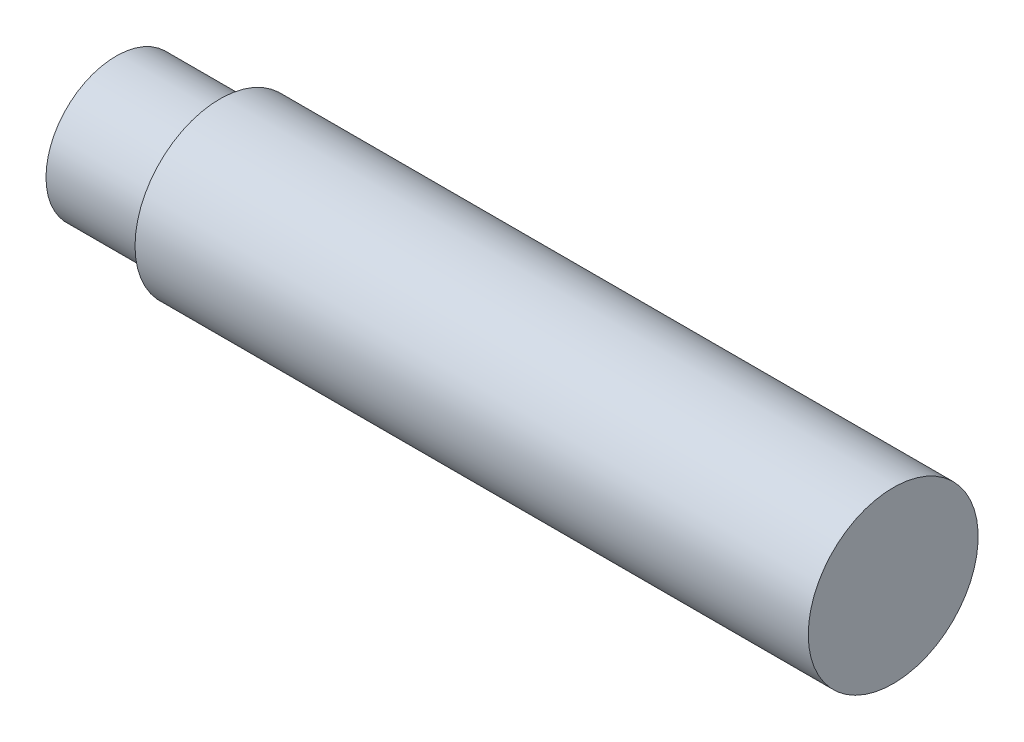
ISO-10303-21;
HEADER;
FILE_DESCRIPTION(('STEP AP214'),'2;1');
FILE_NAME('part.step','',(''),(''),'','','');
FILE_SCHEMA(('AUTOMOTIVE_DESIGN { 1 0 10303 214 1 1 1 1 }'));
ENDSEC;
DATA;
#1=APPLICATION_CONTEXT('core data for automotive mechanical design processes');
#2=APPLICATION_PROTOCOL_DEFINITION('international standard','automotive_design',2000,#1);
#3=PRODUCT_CONTEXT('',#1,'mechanical');
#4=PRODUCT('Part','Part','',(#3));
#5=PRODUCT_RELATED_PRODUCT_CATEGORY('part','',(#4));
#6=PRODUCT_DEFINITION_FORMATION('','',#4);
#7=PRODUCT_DEFINITION_CONTEXT('part definition',#1,'design');
#8=PRODUCT_DEFINITION('design','',#6,#7);
#9=PRODUCT_DEFINITION_SHAPE('','',#8);
#10=(LENGTH_UNIT() NAMED_UNIT(*) SI_UNIT(.MILLI.,.METRE.));
#11=(NAMED_UNIT(*) PLANE_ANGLE_UNIT() SI_UNIT($,.RADIAN.));
#12=(NAMED_UNIT(*) SI_UNIT($,.STERADIAN.) SOLID_ANGLE_UNIT());
#13=UNCERTAINTY_MEASURE_WITH_UNIT(LENGTH_MEASURE(1.E-05),#10,'distance_accuracy_value','');
#14=(GEOMETRIC_REPRESENTATION_CONTEXT(3) GLOBAL_UNCERTAINTY_ASSIGNED_CONTEXT((#13)) GLOBAL_UNIT_ASSIGNED_CONTEXT((#10,
#11,#12)) REPRESENTATION_CONTEXT('',''));
#15=CARTESIAN_POINT('',(0.,0.,0.));
#16=DIRECTION('',(0.,0.,1.));
#17=DIRECTION('',(1.,0.,0.));
#18=AXIS2_PLACEMENT_3D('',#15,#16,#17);
#19=CARTESIAN_POINT('',(0.,0.,0.));
#20=DIRECTION('',(-1.,0.,0.));
#21=DIRECTION('',(0.,0.,1.));
#22=AXIS2_PLACEMENT_3D('',#19,#20,#21);
#23=PLANE('',#22);
#24=CARTESIAN_POINT('',(0.,0.,0.));
#25=DIRECTION('',(-1.,0.,0.));
#26=DIRECTION('',(0.,0.,1.));
#27=AXIS2_PLACEMENT_3D('',#24,#25,#26);
#28=CIRCLE('',#27,1.5875);
#29=CARTESIAN_POINT('',(0.,0.,1.5875));
#30=VERTEX_POINT('',#29);
#31=EDGE_CURVE('E64',#30,#30,#28,.T.);
#32=ORIENTED_EDGE('',*,*,#31,.F.);
#33=EDGE_LOOP('',(#32));
#34=FACE_BOUND('',#33,.T.);
#35=CARTESIAN_POINT('',(0.,0.,0.));
#36=DIRECTION('',(-1.,0.,0.));
#37=DIRECTION('',(0.,0.,1.));
#38=AXIS2_PLACEMENT_3D('',#35,#36,#37);
#39=CIRCLE('',#38,1.9685);
#40=CARTESIAN_POINT('',(0.,0.,1.9685));
#41=VERTEX_POINT('',#40);
#42=EDGE_CURVE('E11',#41,#41,#39,.T.);
#43=ORIENTED_EDGE('',*,*,#42,.T.);
#44=EDGE_LOOP('',(#43));
#45=FACE_BOUND('',#44,.T.);
#46=ADVANCED_FACE('F38',(#34,#45),#23,.T.);
#47=CARTESIAN_POINT('',(0.,0.,0.));
#48=DIRECTION('',(-1.,0.,0.));
#49=DIRECTION('',(0.,0.,1.));
#50=AXIS2_PLACEMENT_3D('',#47,#48,#49);
#51=CYLINDRICAL_SURFACE('',#50,1.9685);
#52=CARTESIAN_POINT('',(2.921,0.,0.));
#53=DIRECTION('',(-1.,0.,0.));
#54=DIRECTION('',(0.,0.,1.));
#55=AXIS2_PLACEMENT_3D('',#52,#53,#54);
#56=CIRCLE('',#55,1.9685);
#57=CARTESIAN_POINT('',(2.921,0.,1.9685));
#58=VERTEX_POINT('',#57);
#59=EDGE_CURVE('E44',#58,#58,#56,.T.);
#60=ORIENTED_EDGE('',*,*,#59,.T.);
#61=EDGE_LOOP('',(#60));
#62=FACE_BOUND('',#61,.T.);
#63=ORIENTED_EDGE('',*,*,#42,.F.);
#64=EDGE_LOOP('',(#63));
#65=FACE_BOUND('',#64,.T.);
#66=ADVANCED_FACE('F72',(#62,#65),#51,.T.);
#67=CARTESIAN_POINT('',(2.921,-1.9685,0.));
#68=DIRECTION('',(-1.,0.,0.));
#69=DIRECTION('',(0.,0.,1.));
#70=AXIS2_PLACEMENT_3D('',#67,#68,#69);
#71=PLANE('',#70);
#72=CARTESIAN_POINT('',(2.921,0.,0.));
#73=DIRECTION('',(-1.,0.,0.));
#74=DIRECTION('',(0.,0.,1.));
#75=AXIS2_PLACEMENT_3D('',#72,#73,#74);
#76=CIRCLE('',#75,2.3876);
#77=CARTESIAN_POINT('',(2.921,0.,2.3876));
#78=VERTEX_POINT('',#77);
#79=EDGE_CURVE('E61',#78,#78,#76,.T.);
#80=ORIENTED_EDGE('',*,*,#79,.T.);
#81=EDGE_LOOP('',(#80));
#82=FACE_BOUND('',#81,.T.);
#83=ORIENTED_EDGE('',*,*,#59,.F.);
#84=EDGE_LOOP('',(#83));
#85=FACE_BOUND('',#84,.T.);
#86=ADVANCED_FACE('F75',(#82,#85),#71,.T.);
#87=CARTESIAN_POINT('',(0.,0.,0.));
#88=DIRECTION('',(-1.,0.,0.));
#89=DIRECTION('',(0.,0.,1.));
#90=AXIS2_PLACEMENT_3D('',#87,#88,#89);
#91=CYLINDRICAL_SURFACE('',#90,2.3876);
#92=CARTESIAN_POINT('',(21.844,0.,0.));
#93=DIRECTION('',(-1.,0.,0.));
#94=DIRECTION('',(0.,0.,1.));
#95=AXIS2_PLACEMENT_3D('',#92,#93,#94);
#96=CIRCLE('',#95,2.3876);
#97=CARTESIAN_POINT('',(21.844,0.,2.3876));
#98=VERTEX_POINT('',#97);
#99=EDGE_CURVE('E57',#98,#98,#96,.T.);
#100=ORIENTED_EDGE('',*,*,#99,.T.);
#101=EDGE_LOOP('',(#100));
#102=FACE_BOUND('',#101,.T.);
#103=ORIENTED_EDGE('',*,*,#79,.F.);
#104=EDGE_LOOP('',(#103));
#105=FACE_BOUND('',#104,.T.);
#106=ADVANCED_FACE('F77',(#102,#105),#91,.T.);
#107=CARTESIAN_POINT('',(21.844,-2.3876,0.));
#108=DIRECTION('',(1.,0.,0.));
#109=DIRECTION('',(0.,0.,-1.));
#110=AXIS2_PLACEMENT_3D('',#107,#108,#109);
#111=PLANE('',#110);
#112=ORIENTED_EDGE('',*,*,#99,.F.);
#113=EDGE_LOOP('',(#112));
#114=FACE_BOUND('',#113,.T.);
#115=ADVANCED_FACE('F51',(#114),#111,.T.);
#116=CARTESIAN_POINT('',(10.414,0.,0.));
#117=DIRECTION('',(-1.,0.,0.));
#118=DIRECTION('',(0.,0.,1.));
#119=AXIS2_PLACEMENT_3D('',#116,#117,#118);
#120=CONICAL_SURFACE('',#119,1.1303,1.02974425867665);
#121=CARTESIAN_POINT('',(11.0931527576869,0.,0.));
#122=VERTEX_POINT('',#121);
#123=VERTEX_LOOP('',#122);
#124=FACE_BOUND('',#123,.T.);
#125=CARTESIAN_POINT('',(10.414,0.,0.));
#126=DIRECTION('',(-1.,0.,0.));
#127=DIRECTION('',(0.,0.,1.));
#128=AXIS2_PLACEMENT_3D('',#125,#126,#127);
#129=CIRCLE('',#128,1.1303);
#130=CARTESIAN_POINT('',(10.414,0.,1.1303));
#131=VERTEX_POINT('',#130);
#132=EDGE_CURVE('E55',#131,#131,#129,.T.);
#133=ORIENTED_EDGE('',*,*,#132,.T.);
#134=EDGE_LOOP('',(#133));
#135=FACE_BOUND('',#134,.T.);
#136=ADVANCED_FACE('F47',(#124,#135),#120,.F.);
#137=CARTESIAN_POINT('',(0.,0.,0.));
#138=DIRECTION('',(-1.,0.,0.));
#139=DIRECTION('',(0.,0.,1.));
#140=AXIS2_PLACEMENT_3D('',#137,#138,#139);
#141=CYLINDRICAL_SURFACE('',#140,1.13029999999999);
#142=ORIENTED_EDGE('',*,*,#132,.F.);
#143=EDGE_LOOP('',(#142));
#144=FACE_BOUND('',#143,.T.);
#145=CARTESIAN_POINT('',(0.791893629220511,0.,0.));
#146=DIRECTION('',(-1.,0.,0.));
#147=DIRECTION('',(0.,0.,1.));
#148=AXIS2_PLACEMENT_3D('',#145,#146,#147);
#149=CIRCLE('',#148,1.13029999999999);
#150=CARTESIAN_POINT('',(0.791893629220511,0.,1.13029999999999));
#151=VERTEX_POINT('',#150);
#152=EDGE_CURVE('E58',#151,#151,#149,.T.);
#153=ORIENTED_EDGE('',*,*,#152,.T.);
#154=EDGE_LOOP('',(#153));
#155=FACE_BOUND('',#154,.T.);
#156=ADVANCED_FACE('F50',(#144,#155),#141,.F.);
#157=CARTESIAN_POINT('',(0.,0.,0.));
#158=DIRECTION('',(-1.,0.,0.));
#159=DIRECTION('',(0.,0.,1.));
#160=AXIS2_PLACEMENT_3D('',#157,#158,#159);
#161=CONICAL_SURFACE('',#160,1.5875,0.523598775598298);
#162=ORIENTED_EDGE('',*,*,#152,.F.);
#163=EDGE_LOOP('',(#162));
#164=FACE_BOUND('',#163,.T.);
#165=ORIENTED_EDGE('',*,*,#31,.T.);
#166=EDGE_LOOP('',(#165));
#167=FACE_BOUND('',#166,.T.);
#168=ADVANCED_FACE('F95',(#164,#167),#161,.F.);
#169=CLOSED_SHELL('',(#46,#66,#86,#106,#115,#136,#156,#168));
#170=MANIFOLD_SOLID_BREP('B2',#169);
#171=ADVANCED_BREP_SHAPE_REPRESENTATION('',(#18,#170),#14);
#172=SHAPE_DEFINITION_REPRESENTATION(#9,#171);
ENDSEC;
END-ISO-10303-21;
